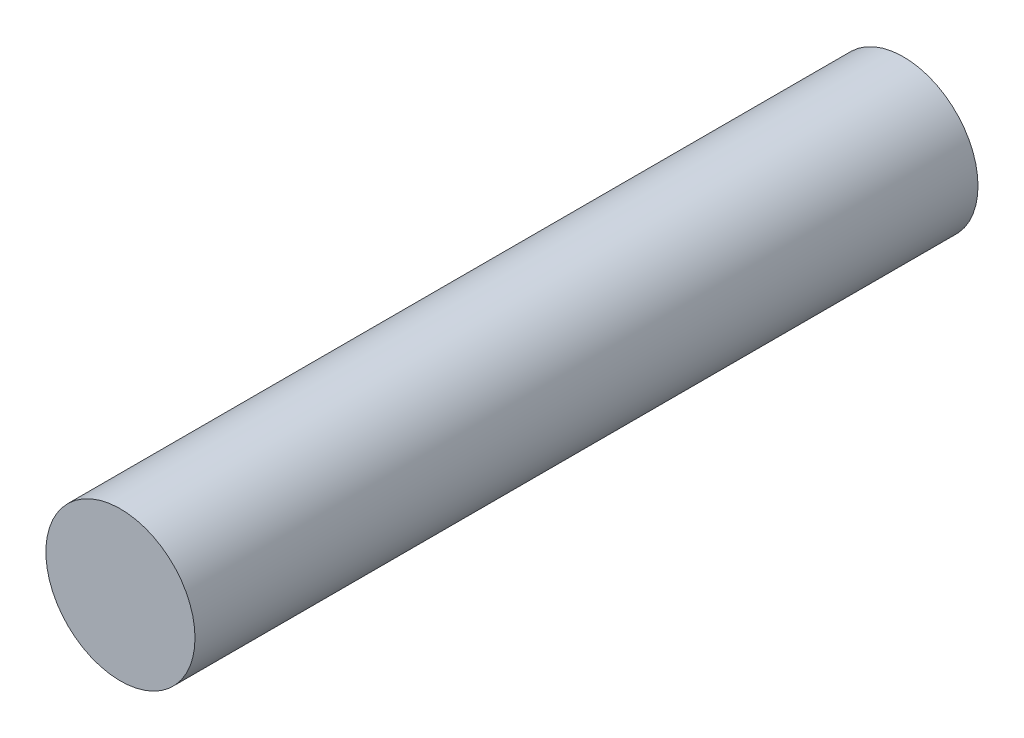
ISO-10303-21;
HEADER;
FILE_DESCRIPTION(('STEP AP214'),'2;1');
FILE_NAME('part.step','',(''),(''),'','','');
FILE_SCHEMA(('AUTOMOTIVE_DESIGN { 1 0 10303 214 1 1 1 1 }'));
ENDSEC;
DATA;
#1=APPLICATION_CONTEXT('core data for automotive mechanical design processes');
#2=APPLICATION_PROTOCOL_DEFINITION('international standard','automotive_design',2000,#1);
#3=PRODUCT_CONTEXT('',#1,'mechanical');
#4=PRODUCT('Part','Part','',(#3));
#5=PRODUCT_RELATED_PRODUCT_CATEGORY('part','',(#4));
#6=PRODUCT_DEFINITION_FORMATION('','',#4);
#7=PRODUCT_DEFINITION_CONTEXT('part definition',#1,'design');
#8=PRODUCT_DEFINITION('design','',#6,#7);
#9=PRODUCT_DEFINITION_SHAPE('','',#8);
#10=(LENGTH_UNIT() NAMED_UNIT(*) SI_UNIT(.MILLI.,.METRE.));
#11=(NAMED_UNIT(*) PLANE_ANGLE_UNIT() SI_UNIT($,.RADIAN.));
#12=(NAMED_UNIT(*) SI_UNIT($,.STERADIAN.) SOLID_ANGLE_UNIT());
#13=UNCERTAINTY_MEASURE_WITH_UNIT(LENGTH_MEASURE(1.E-05),#10,'distance_accuracy_value','');
#14=(GEOMETRIC_REPRESENTATION_CONTEXT(3) GLOBAL_UNCERTAINTY_ASSIGNED_CONTEXT((#13)) GLOBAL_UNIT_ASSIGNED_CONTEXT((#10,
#11,#12)) REPRESENTATION_CONTEXT('',''));
#15=CARTESIAN_POINT('',(0.,0.,0.));
#16=DIRECTION('',(0.,0.,1.));
#17=DIRECTION('',(1.,0.,0.));
#18=AXIS2_PLACEMENT_3D('',#15,#16,#17);
#19=CARTESIAN_POINT('',(0.,0.,105.));
#20=DIRECTION('',(0.,0.,-1.));
#21=DIRECTION('',(-1.,0.,0.));
#22=AXIS2_PLACEMENT_3D('',#19,#20,#21);
#23=CYLINDRICAL_SURFACE('',#22,10.);
#24=CARTESIAN_POINT('',(0.,0.,105.));
#25=DIRECTION('',(0.,0.,1.));
#26=DIRECTION('',(1.,0.,0.));
#27=AXIS2_PLACEMENT_3D('',#24,#25,#26);
#28=CIRCLE('',#27,10.);
#29=CARTESIAN_POINT('',(10.,0.,105.));
#30=VERTEX_POINT('',#29);
#31=EDGE_CURVE('E10',#30,#30,#28,.T.);
#32=ORIENTED_EDGE('',*,*,#31,.F.);
#33=EDGE_LOOP('',(#32));
#34=FACE_BOUND('',#33,.T.);
#35=CARTESIAN_POINT('',(0.,0.,0.));
#36=DIRECTION('',(0.,0.,1.));
#37=DIRECTION('',(1.,0.,0.));
#38=AXIS2_PLACEMENT_3D('',#35,#36,#37);
#39=CIRCLE('',#38,10.);
#40=CARTESIAN_POINT('',(10.,0.,0.));
#41=VERTEX_POINT('',#40);
#42=EDGE_CURVE('E36',#41,#41,#39,.T.);
#43=ORIENTED_EDGE('',*,*,#42,.T.);
#44=EDGE_LOOP('',(#43));
#45=FACE_BOUND('',#44,.T.);
#46=ADVANCED_FACE('F33',(#34,#45),#23,.T.);
#47=CARTESIAN_POINT('',(0.,0.,105.));
#48=DIRECTION('',(0.,0.,1.));
#49=DIRECTION('',(1.,0.,0.));
#50=AXIS2_PLACEMENT_3D('',#47,#48,#49);
#51=PLANE('',#50);
#52=ORIENTED_EDGE('',*,*,#31,.T.);
#53=EDGE_LOOP('',(#52));
#54=FACE_BOUND('',#53,.T.);
#55=ADVANCED_FACE('F48',(#54),#51,.T.);
#56=CARTESIAN_POINT('',(0.,0.,0.));
#57=DIRECTION('',(0.,0.,1.));
#58=DIRECTION('',(1.,0.,0.));
#59=AXIS2_PLACEMENT_3D('',#56,#57,#58);
#60=PLANE('',#59);
#61=ORIENTED_EDGE('',*,*,#42,.F.);
#62=EDGE_LOOP('',(#61));
#63=FACE_BOUND('',#62,.T.);
#64=ADVANCED_FACE('F46',(#63),#60,.F.);
#65=CLOSED_SHELL('',(#46,#55,#64));
#66=MANIFOLD_SOLID_BREP('B2',#65);
#67=ADVANCED_BREP_SHAPE_REPRESENTATION('',(#18,#66),#14);
#68=SHAPE_DEFINITION_REPRESENTATION(#9,#67);
ENDSEC;
END-ISO-10303-21;
